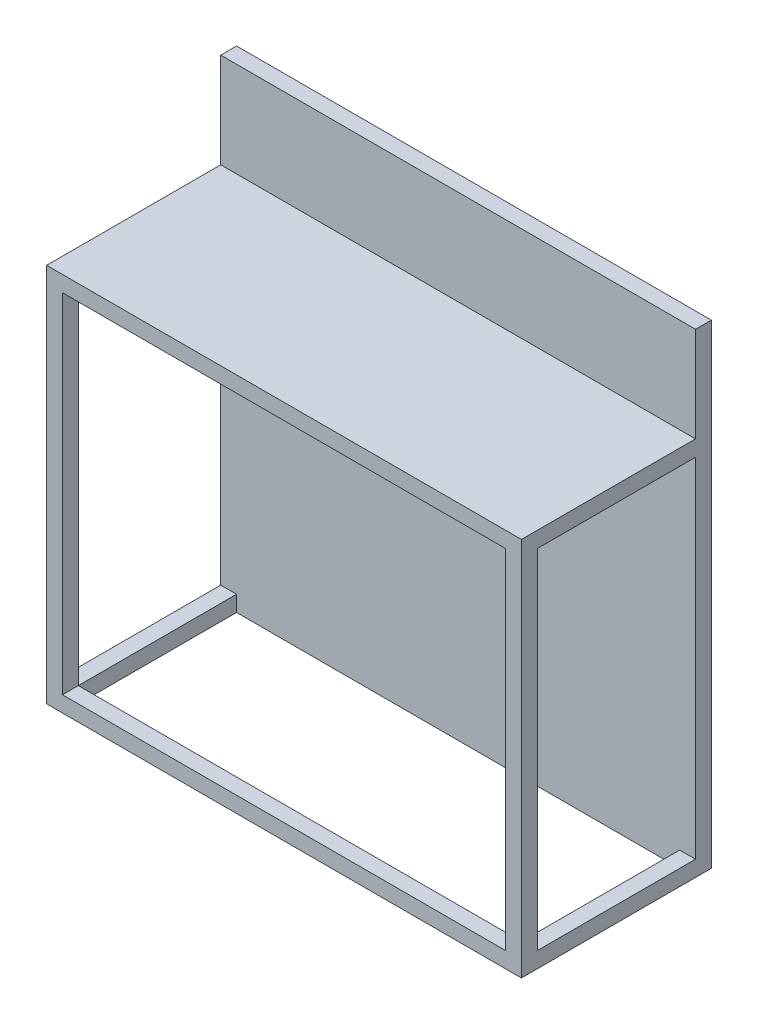
ISO-10303-21;
HEADER;
FILE_DESCRIPTION(('STEP AP214'),'2;1');
FILE_NAME('part.step','',(''),(''),'','','');
FILE_SCHEMA(('AUTOMOTIVE_DESIGN { 1 0 10303 214 1 1 1 1 }'));
ENDSEC;
DATA;
#1=APPLICATION_CONTEXT('core data for automotive mechanical design processes');
#2=APPLICATION_PROTOCOL_DEFINITION('international standard','automotive_design',2000,#1);
#3=PRODUCT_CONTEXT('',#1,'mechanical');
#4=PRODUCT('Part','Part','',(#3));
#5=PRODUCT_RELATED_PRODUCT_CATEGORY('part','',(#4));
#6=PRODUCT_DEFINITION_FORMATION('','',#4);
#7=PRODUCT_DEFINITION_CONTEXT('part definition',#1,'design');
#8=PRODUCT_DEFINITION('design','',#6,#7);
#9=PRODUCT_DEFINITION_SHAPE('','',#8);
#10=(LENGTH_UNIT() NAMED_UNIT(*) SI_UNIT(.MILLI.,.METRE.));
#11=(NAMED_UNIT(*) PLANE_ANGLE_UNIT() SI_UNIT($,.RADIAN.));
#12=(NAMED_UNIT(*) SI_UNIT($,.STERADIAN.) SOLID_ANGLE_UNIT());
#13=UNCERTAINTY_MEASURE_WITH_UNIT(LENGTH_MEASURE(1.E-05),#10,'distance_accuracy_value','');
#14=(GEOMETRIC_REPRESENTATION_CONTEXT(3) GLOBAL_UNCERTAINTY_ASSIGNED_CONTEXT((#13)) GLOBAL_UNIT_ASSIGNED_CONTEXT((#10,
#11,#12)) REPRESENTATION_CONTEXT('',''));
#15=CARTESIAN_POINT('',(0.,0.,0.));
#16=DIRECTION('',(0.,0.,1.));
#17=DIRECTION('',(1.,0.,0.));
#18=AXIS2_PLACEMENT_3D('',#15,#16,#17);
#19=CARTESIAN_POINT('',(700.,400.,550.));
#20=DIRECTION('',(0.,0.,1.));
#21=DIRECTION('',(1.,0.,0.));
#22=AXIS2_PLACEMENT_3D('',#19,#20,#21);
#23=PLANE('',#22);
#24=DIRECTION('',(-1.,0.,0.));
#25=VECTOR('',#24,1.);
#26=CARTESIAN_POINT('',(700.,400.,550.));
#27=LINE('',#26,#25);
#28=CARTESIAN_POINT('',(-700.,400.,550.));
#29=VERTEX_POINT('',#28);
#30=CARTESIAN_POINT('',(-750.,400.,550.));
#31=VERTEX_POINT('',#30);
#32=EDGE_CURVE('E226',#29,#31,#27,.T.);
#33=ORIENTED_EDGE('',*,*,#32,.F.);
#34=DIRECTION('',(0.,-1.,0.));
#35=VECTOR('',#34,1.);
#36=CARTESIAN_POINT('',(-700.,400.,550.));
#37=LINE('',#36,#35);
#38=CARTESIAN_POINT('',(-700.,-700.,550.));
#39=VERTEX_POINT('',#38);
#40=EDGE_CURVE('E183',#29,#39,#37,.T.);
#41=ORIENTED_EDGE('',*,*,#40,.T.);
#42=DIRECTION('',(-1.,0.,0.));
#43=VECTOR('',#42,1.);
#44=CARTESIAN_POINT('',(1614.,-700.,550.));
#45=LINE('',#44,#43);
#46=CARTESIAN_POINT('',(-750.,-700.,550.));
#47=VERTEX_POINT('',#46);
#48=EDGE_CURVE('E202',#39,#47,#45,.T.);
#49=ORIENTED_EDGE('',*,*,#48,.T.);
#50=DIRECTION('',(0.,1.,0.));
#51=VECTOR('',#50,1.);
#52=CARTESIAN_POINT('',(-750.,400.,550.));
#53=LINE('',#52,#51);
#54=EDGE_CURVE('E195',#47,#31,#53,.T.);
#55=ORIENTED_EDGE('',*,*,#54,.T.);
#56=EDGE_LOOP('',(#33,#41,#49,#55));
#57=FACE_BOUND('',#56,.T.);
#58=ADVANCED_FACE('F33',(#57),#23,.F.);
#59=CARTESIAN_POINT('',(750.,-700.,550.));
#60=VERTEX_POINT('',#59);
#61=CARTESIAN_POINT('',(700.,-700.,550.));
#62=VERTEX_POINT('',#61);
#63=EDGE_CURVE('E204',#60,#62,#45,.T.);
#64=ORIENTED_EDGE('',*,*,#63,.T.);
#65=DIRECTION('',(0.,1.,0.));
#66=VECTOR('',#65,1.);
#67=CARTESIAN_POINT('',(700.,400.,550.));
#68=LINE('',#67,#66);
#69=CARTESIAN_POINT('',(700.,400.,550.));
#70=VERTEX_POINT('',#69);
#71=EDGE_CURVE('E161',#62,#70,#68,.T.);
#72=ORIENTED_EDGE('',*,*,#71,.T.);
#73=CARTESIAN_POINT('',(750.,400.,550.));
#74=VERTEX_POINT('',#73);
#75=EDGE_CURVE('E228',#74,#70,#27,.T.);
#76=ORIENTED_EDGE('',*,*,#75,.F.);
#77=DIRECTION('',(0.,1.,0.));
#78=VECTOR('',#77,1.);
#79=CARTESIAN_POINT('',(750.,-750.,550.));
#80=LINE('',#79,#78);
#81=EDGE_CURVE('E207',#60,#74,#80,.T.);
#82=ORIENTED_EDGE('',*,*,#81,.F.);
#83=EDGE_LOOP('',(#64,#72,#76,#82));
#84=FACE_BOUND('',#83,.T.);
#85=ADVANCED_FACE('F324',(#84),#23,.F.);
#86=CARTESIAN_POINT('',(-750.,-750.,600.));
#87=DIRECTION('',(1.,0.,0.));
#88=DIRECTION('',(0.,0.,-1.));
#89=AXIS2_PLACEMENT_3D('',#86,#87,#88);
#90=PLANE('',#89);
#91=DIRECTION('',(0.,0.,1.));
#92=VECTOR('',#91,1.);
#93=CARTESIAN_POINT('',(-750.,-700.,50.0000000000001));
#94=LINE('',#93,#92);
#95=CARTESIAN_POINT('',(-750.,-700.,50.0000000000002));
#96=VERTEX_POINT('',#95);
#97=EDGE_CURVE('E192',#96,#47,#94,.T.);
#98=ORIENTED_EDGE('',*,*,#97,.F.);
#99=DIRECTION('',(0.,-1.,0.));
#100=VECTOR('',#99,1.);
#101=CARTESIAN_POINT('',(-750.,400.,50.));
#102=LINE('',#101,#100);
#103=CARTESIAN_POINT('',(-750.,400.,50.));
#104=VERTEX_POINT('',#103);
#105=EDGE_CURVE('E56',#104,#96,#102,.T.);
#106=ORIENTED_EDGE('',*,*,#105,.F.);
#107=DIRECTION('',(0.,0.,-1.));
#108=VECTOR('',#107,1.);
#109=CARTESIAN_POINT('',(-750.,400.,50.));
#110=LINE('',#109,#108);
#111=EDGE_CURVE('E198',#31,#104,#110,.T.);
#112=ORIENTED_EDGE('',*,*,#111,.F.);
#113=ORIENTED_EDGE('',*,*,#54,.F.);
#114=EDGE_LOOP('',(#98,#106,#112,#113));
#115=FACE_BOUND('',#114,.T.);
#116=DIRECTION('',(0.,0.,1.));
#117=VECTOR('',#116,1.);
#118=CARTESIAN_POINT('',(-750.,450.,50.));
#119=LINE('',#118,#117);
#120=CARTESIAN_POINT('',(-750.,450.,50.));
#121=VERTEX_POINT('',#120);
#122=CARTESIAN_POINT('',(-750.,450.,600.));
#123=VERTEX_POINT('',#122);
#124=EDGE_CURVE('E254',#121,#123,#119,.T.);
#125=ORIENTED_EDGE('',*,*,#124,.F.);
#126=DIRECTION('',(0.,-1.,0.));
#127=VECTOR('',#126,1.);
#128=CARTESIAN_POINT('',(-750.,750.,50.));
#129=LINE('',#128,#127);
#130=CARTESIAN_POINT('',(-750.,750.,50.));
#131=VERTEX_POINT('',#130);
#132=EDGE_CURVE('E251',#131,#121,#129,.T.);
#133=ORIENTED_EDGE('',*,*,#132,.F.);
#134=DIRECTION('',(0.,0.,-1.));
#135=VECTOR('',#134,1.);
#136=CARTESIAN_POINT('',(-750.,750.,600.));
#137=LINE('',#136,#135);
#138=CARTESIAN_POINT('',(-750.,750.,0.));
#139=VERTEX_POINT('',#138);
#140=EDGE_CURVE('E275',#131,#139,#137,.T.);
#141=ORIENTED_EDGE('',*,*,#140,.T.);
#142=DIRECTION('',(0.,-1.,0.));
#143=VECTOR('',#142,1.);
#144=CARTESIAN_POINT('',(-750.,-750.,0.));
#145=LINE('',#144,#143);
#146=CARTESIAN_POINT('',(-750.,-750.,0.));
#147=VERTEX_POINT('',#146);
#148=EDGE_CURVE('E266',#139,#147,#145,.T.);
#149=ORIENTED_EDGE('',*,*,#148,.T.);
#150=DIRECTION('',(0.,0.,-1.));
#151=VECTOR('',#150,1.);
#152=CARTESIAN_POINT('',(-750.,-750.,600.));
#153=LINE('',#152,#151);
#154=CARTESIAN_POINT('',(-750.,-750.,600.));
#155=VERTEX_POINT('',#154);
#156=EDGE_CURVE('E11',#155,#147,#153,.T.);
#157=ORIENTED_EDGE('',*,*,#156,.F.);
#158=DIRECTION('',(0.,-1.,0.));
#159=VECTOR('',#158,1.);
#160=CARTESIAN_POINT('',(-750.,-750.,600.));
#161=LINE('',#160,#159);
#162=EDGE_CURVE('E267',#123,#155,#161,.T.);
#163=ORIENTED_EDGE('',*,*,#162,.F.);
#164=EDGE_LOOP('',(#125,#133,#141,#149,#157,#163));
#165=FACE_BOUND('',#164,.T.);
#166=ADVANCED_FACE('F35',(#115,#165),#90,.F.);
#167=CARTESIAN_POINT('',(750.,-750.,600.));
#168=DIRECTION('',(0.,1.,0.));
#169=DIRECTION('',(-1.,0.,0.));
#170=AXIS2_PLACEMENT_3D('',#167,#168,#169);
#171=PLANE('',#170);
#172=DIRECTION('',(1.,0.,0.));
#173=VECTOR('',#172,1.);
#174=CARTESIAN_POINT('',(700.,-750.,50.0000000000001));
#175=LINE('',#174,#173);
#176=CARTESIAN_POINT('',(-700.,-750.,49.9999999999999));
#177=VERTEX_POINT('',#176);
#178=CARTESIAN_POINT('',(700.,-750.,50.0000000000001));
#179=VERTEX_POINT('',#178);
#180=EDGE_CURVE('E234',#177,#179,#175,.T.);
#181=ORIENTED_EDGE('',*,*,#180,.F.);
#182=DIRECTION('',(0.,0.,-1.));
#183=VECTOR('',#182,1.);
#184=CARTESIAN_POINT('',(-700.,-750.,49.9999999999999));
#185=LINE('',#184,#183);
#186=CARTESIAN_POINT('',(-700.,-750.,550.));
#187=VERTEX_POINT('',#186);
#188=EDGE_CURVE('E223',#187,#177,#185,.T.);
#189=ORIENTED_EDGE('',*,*,#188,.F.);
#190=DIRECTION('',(-1.,0.,0.));
#191=VECTOR('',#190,1.);
#192=CARTESIAN_POINT('',(700.,-750.,550.));
#193=LINE('',#192,#191);
#194=CARTESIAN_POINT('',(700.,-750.,550.));
#195=VERTEX_POINT('',#194);
#196=EDGE_CURVE('E227',#195,#187,#193,.T.);
#197=ORIENTED_EDGE('',*,*,#196,.F.);
#198=DIRECTION('',(0.,0.,1.));
#199=VECTOR('',#198,1.);
#200=CARTESIAN_POINT('',(700.,-750.,50.0000000000001));
#201=LINE('',#200,#199);
#202=EDGE_CURVE('E237',#179,#195,#201,.T.);
#203=ORIENTED_EDGE('',*,*,#202,.F.);
#204=EDGE_LOOP('',(#181,#189,#197,#203));
#205=FACE_BOUND('',#204,.T.);
#206=DIRECTION('',(1.,0.,0.));
#207=VECTOR('',#206,1.);
#208=CARTESIAN_POINT('',(750.,-750.,0.));
#209=LINE('',#208,#207);
#210=CARTESIAN_POINT('',(750.,-750.,0.));
#211=VERTEX_POINT('',#210);
#212=EDGE_CURVE('E278',#147,#211,#209,.T.);
#213=ORIENTED_EDGE('',*,*,#212,.T.);
#214=DIRECTION('',(0.,0.,-1.));
#215=VECTOR('',#214,1.);
#216=CARTESIAN_POINT('',(750.,-750.,600.));
#217=LINE('',#216,#215);
#218=CARTESIAN_POINT('',(750.,-750.,600.));
#219=VERTEX_POINT('',#218);
#220=EDGE_CURVE('E41',#219,#211,#217,.T.);
#221=ORIENTED_EDGE('',*,*,#220,.F.);
#222=DIRECTION('',(1.,0.,0.));
#223=VECTOR('',#222,1.);
#224=CARTESIAN_POINT('',(750.,-750.,600.));
#225=LINE('',#224,#223);
#226=EDGE_CURVE('E269',#155,#219,#225,.T.);
#227=ORIENTED_EDGE('',*,*,#226,.F.);
#228=ORIENTED_EDGE('',*,*,#156,.T.);
#229=EDGE_LOOP('',(#213,#221,#227,#228));
#230=FACE_BOUND('',#229,.T.);
#231=ADVANCED_FACE('F315',(#205,#230),#171,.F.);
#232=CARTESIAN_POINT('',(750.,-750.,600.));
#233=DIRECTION('',(-1.,0.,0.));
#234=DIRECTION('',(0.,0.,1.));
#235=AXIS2_PLACEMENT_3D('',#232,#233,#234);
#236=PLANE('',#235);
#237=DIRECTION('',(0.,0.,-1.));
#238=VECTOR('',#237,1.);
#239=CARTESIAN_POINT('',(750.,400.,600.));
#240=LINE('',#239,#238);
#241=CARTESIAN_POINT('',(750.,400.,50.));
#242=VERTEX_POINT('',#241);
#243=EDGE_CURVE('E220',#74,#242,#240,.T.);
#244=ORIENTED_EDGE('',*,*,#243,.T.);
#245=DIRECTION('',(0.,-1.,0.));
#246=VECTOR('',#245,1.);
#247=CARTESIAN_POINT('',(750.,-750.,50.0000000000002));
#248=LINE('',#247,#246);
#249=CARTESIAN_POINT('',(750.,-700.,50.0000000000001));
#250=VERTEX_POINT('',#249);
#251=EDGE_CURVE('E210',#242,#250,#248,.T.);
#252=ORIENTED_EDGE('',*,*,#251,.T.);
#253=DIRECTION('',(0.,0.,1.));
#254=VECTOR('',#253,1.);
#255=CARTESIAN_POINT('',(750.,-700.,600.));
#256=LINE('',#255,#254);
#257=EDGE_CURVE('E217',#250,#60,#256,.T.);
#258=ORIENTED_EDGE('',*,*,#257,.T.);
#259=ORIENTED_EDGE('',*,*,#81,.T.);
#260=EDGE_LOOP('',(#244,#252,#258,#259));
#261=FACE_BOUND('',#260,.T.);
#262=DIRECTION('',(0.,0.,-1.));
#263=VECTOR('',#262,1.);
#264=CARTESIAN_POINT('',(750.,750.,600.));
#265=LINE('',#264,#263);
#266=CARTESIAN_POINT('',(750.,750.,50.));
#267=VERTEX_POINT('',#266);
#268=CARTESIAN_POINT('',(750.,750.,0.));
#269=VERTEX_POINT('',#268);
#270=EDGE_CURVE('E286',#267,#269,#265,.T.);
#271=ORIENTED_EDGE('',*,*,#270,.F.);
#272=DIRECTION('',(0.,1.,0.));
#273=VECTOR('',#272,1.);
#274=CARTESIAN_POINT('',(750.,750.,50.));
#275=LINE('',#274,#273);
#276=CARTESIAN_POINT('',(750.,450.,50.));
#277=VERTEX_POINT('',#276);
#278=EDGE_CURVE('E244',#277,#267,#275,.T.);
#279=ORIENTED_EDGE('',*,*,#278,.F.);
#280=DIRECTION('',(0.,0.,-1.));
#281=VECTOR('',#280,1.);
#282=CARTESIAN_POINT('',(750.,450.,50.));
#283=LINE('',#282,#281);
#284=CARTESIAN_POINT('',(750.,450.,600.));
#285=VERTEX_POINT('',#284);
#286=EDGE_CURVE('E259',#285,#277,#283,.T.);
#287=ORIENTED_EDGE('',*,*,#286,.F.);
#288=DIRECTION('',(0.,1.,0.));
#289=VECTOR('',#288,1.);
#290=CARTESIAN_POINT('',(750.,-750.,600.));
#291=LINE('',#290,#289);
#292=EDGE_CURVE('E272',#219,#285,#291,.T.);
#293=ORIENTED_EDGE('',*,*,#292,.F.);
#294=ORIENTED_EDGE('',*,*,#220,.T.);
#295=DIRECTION('',(0.,1.,0.));
#296=VECTOR('',#295,1.);
#297=CARTESIAN_POINT('',(750.,-750.,0.));
#298=LINE('',#297,#296);
#299=EDGE_CURVE('E280',#211,#269,#298,.T.);
#300=ORIENTED_EDGE('',*,*,#299,.T.);
#301=EDGE_LOOP('',(#271,#279,#287,#293,#294,#300));
#302=FACE_BOUND('',#301,.T.);
#303=ADVANCED_FACE('F293',(#261,#302),#236,.F.);
#304=CARTESIAN_POINT('',(750.,750.,600.));
#305=DIRECTION('',(0.,-1.,0.));
#306=DIRECTION('',(1.,0.,0.));
#307=AXIS2_PLACEMENT_3D('',#304,#305,#306);
#308=PLANE('',#307);
#309=ORIENTED_EDGE('',*,*,#140,.F.);
#310=DIRECTION('',(-1.,0.,0.));
#311=VECTOR('',#310,1.);
#312=CARTESIAN_POINT('',(750.001,750.,50.));
#313=LINE('',#312,#311);
#314=EDGE_CURVE('E257',#267,#131,#313,.T.);
#315=ORIENTED_EDGE('',*,*,#314,.F.);
#316=ORIENTED_EDGE('',*,*,#270,.T.);
#317=DIRECTION('',(-1.,0.,0.));
#318=VECTOR('',#317,1.);
#319=CARTESIAN_POINT('',(750.,750.,0.));
#320=LINE('',#319,#318);
#321=EDGE_CURVE('E270',#269,#139,#320,.T.);
#322=ORIENTED_EDGE('',*,*,#321,.T.);
#323=EDGE_LOOP('',(#309,#315,#316,#322));
#324=FACE_BOUND('',#323,.T.);
#325=ADVANCED_FACE('F303',(#324),#308,.F.);
#326=CARTESIAN_POINT('',(0.,0.,600.));
#327=DIRECTION('',(0.,0.,1.));
#328=DIRECTION('',(1.,0.,0.));
#329=AXIS2_PLACEMENT_3D('',#326,#327,#328);
#330=PLANE('',#329);
#331=DIRECTION('',(0.,-1.,0.));
#332=VECTOR('',#331,1.);
#333=CARTESIAN_POINT('',(-700.,400.,600.));
#334=LINE('',#333,#332);
#335=CARTESIAN_POINT('',(-700.,400.,600.));
#336=VERTEX_POINT('',#335);
#337=CARTESIAN_POINT('',(-700.,-700.,600.));
#338=VERTEX_POINT('',#337);
#339=EDGE_CURVE('E48',#336,#338,#334,.T.);
#340=ORIENTED_EDGE('',*,*,#339,.F.);
#341=DIRECTION('',(-1.,0.,0.));
#342=VECTOR('',#341,1.);
#343=CARTESIAN_POINT('',(-700.,400.,600.));
#344=LINE('',#343,#342);
#345=CARTESIAN_POINT('',(700.,400.,600.));
#346=VERTEX_POINT('',#345);
#347=EDGE_CURVE('E176',#346,#336,#344,.T.);
#348=ORIENTED_EDGE('',*,*,#347,.F.);
#349=DIRECTION('',(0.,1.,0.));
#350=VECTOR('',#349,1.);
#351=CARTESIAN_POINT('',(700.,400.,600.));
#352=LINE('',#351,#350);
#353=CARTESIAN_POINT('',(700.,-700.,600.));
#354=VERTEX_POINT('',#353);
#355=EDGE_CURVE('E158',#354,#346,#352,.T.);
#356=ORIENTED_EDGE('',*,*,#355,.F.);
#357=DIRECTION('',(1.,0.,0.));
#358=VECTOR('',#357,1.);
#359=CARTESIAN_POINT('',(-700.,-700.,600.));
#360=LINE('',#359,#358);
#361=EDGE_CURVE('E169',#338,#354,#360,.T.);
#362=ORIENTED_EDGE('',*,*,#361,.F.);
#363=EDGE_LOOP('',(#340,#348,#356,#362));
#364=FACE_BOUND('',#363,.T.);
#365=DIRECTION('',(-1.,0.,0.));
#366=VECTOR('',#365,1.);
#367=CARTESIAN_POINT('',(750.001,450.,600.));
#368=LINE('',#367,#366);
#369=EDGE_CURVE('E260',#285,#123,#368,.T.);
#370=ORIENTED_EDGE('',*,*,#369,.T.);
#371=ORIENTED_EDGE('',*,*,#162,.T.);
#372=ORIENTED_EDGE('',*,*,#226,.T.);
#373=ORIENTED_EDGE('',*,*,#292,.T.);
#374=EDGE_LOOP('',(#370,#371,#372,#373));
#375=FACE_BOUND('',#374,.T.);
#376=ADVANCED_FACE('F173',(#364,#375),#330,.T.);
#377=CARTESIAN_POINT('',(0.,0.,0.));
#378=DIRECTION('',(0.,0.,1.));
#379=DIRECTION('',(1.,0.,0.));
#380=AXIS2_PLACEMENT_3D('',#377,#378,#379);
#381=PLANE('',#380);
#382=ORIENTED_EDGE('',*,*,#148,.F.);
#383=ORIENTED_EDGE('',*,*,#321,.F.);
#384=ORIENTED_EDGE('',*,*,#299,.F.);
#385=ORIENTED_EDGE('',*,*,#212,.F.);
#386=EDGE_LOOP('',(#382,#383,#384,#385));
#387=FACE_BOUND('',#386,.T.);
#388=ADVANCED_FACE('F300',(#387),#381,.F.);
#389=CARTESIAN_POINT('',(750.001,750.,50.));
#390=DIRECTION('',(0.,0.,-1.));
#391=DIRECTION('',(0.,1.,0.));
#392=AXIS2_PLACEMENT_3D('',#389,#390,#391);
#393=PLANE('',#392);
#394=ORIENTED_EDGE('',*,*,#278,.T.);
#395=ORIENTED_EDGE('',*,*,#314,.T.);
#396=ORIENTED_EDGE('',*,*,#132,.T.);
#397=DIRECTION('',(-1.,0.,0.));
#398=VECTOR('',#397,1.);
#399=CARTESIAN_POINT('',(750.001,450.,50.));
#400=LINE('',#399,#398);
#401=EDGE_CURVE('E256',#277,#121,#400,.T.);
#402=ORIENTED_EDGE('',*,*,#401,.F.);
#403=EDGE_LOOP('',(#394,#395,#396,#402));
#404=FACE_BOUND('',#403,.T.);
#405=ADVANCED_FACE('F307',(#404),#393,.F.);
#406=CARTESIAN_POINT('',(750.001,450.,50.));
#407=DIRECTION('',(0.,-1.,0.));
#408=DIRECTION('',(0.,0.,-1.));
#409=AXIS2_PLACEMENT_3D('',#406,#407,#408);
#410=PLANE('',#409);
#411=ORIENTED_EDGE('',*,*,#286,.T.);
#412=ORIENTED_EDGE('',*,*,#401,.T.);
#413=ORIENTED_EDGE('',*,*,#124,.T.);
#414=ORIENTED_EDGE('',*,*,#369,.F.);
#415=EDGE_LOOP('',(#411,#412,#413,#414));
#416=FACE_BOUND('',#415,.T.);
#417=ADVANCED_FACE('F311',(#416),#410,.F.);
#418=CARTESIAN_POINT('',(-700.,400.,49.9999999999999));
#419=DIRECTION('',(-1.,0.,0.));
#420=DIRECTION('',(0.,-1.,0.));
#421=AXIS2_PLACEMENT_3D('',#418,#419,#420);
#422=PLANE('',#421);
#423=DIRECTION('',(0.,-1.,0.));
#424=VECTOR('',#423,1.);
#425=CARTESIAN_POINT('',(-700.,400.,49.9999999999999));
#426=LINE('',#425,#424);
#427=CARTESIAN_POINT('',(-700.,-700.,50.0000000000001));
#428=VERTEX_POINT('',#427);
#429=EDGE_CURVE('E231',#428,#177,#426,.T.);
#430=ORIENTED_EDGE('',*,*,#429,.F.);
#431=DIRECTION('',(0.,0.,1.));
#432=VECTOR('',#431,1.);
#433=CARTESIAN_POINT('',(-700.,-700.,49.9999999999999));
#434=LINE('',#433,#432);
#435=EDGE_CURVE('E215',#428,#39,#434,.T.);
#436=ORIENTED_EDGE('',*,*,#435,.T.);
#437=DIRECTION('',(0.,-1.,0.));
#438=VECTOR('',#437,1.);
#439=CARTESIAN_POINT('',(-700.,400.,550.));
#440=LINE('',#439,#438);
#441=EDGE_CURVE('E242',#39,#187,#440,.T.);
#442=ORIENTED_EDGE('',*,*,#441,.T.);
#443=ORIENTED_EDGE('',*,*,#188,.T.);
#444=EDGE_LOOP('',(#430,#436,#442,#443));
#445=FACE_BOUND('',#444,.T.);
#446=ADVANCED_FACE('F340',(#445),#422,.F.);
#447=ORIENTED_EDGE('',*,*,#441,.F.);
#448=DIRECTION('',(1.,0.,0.));
#449=VECTOR('',#448,1.);
#450=CARTESIAN_POINT('',(700.,-700.,550.));
#451=LINE('',#450,#449);
#452=EDGE_CURVE('E189',#39,#62,#451,.T.);
#453=ORIENTED_EDGE('',*,*,#452,.T.);
#454=DIRECTION('',(0.,-1.,0.));
#455=VECTOR('',#454,1.);
#456=CARTESIAN_POINT('',(700.,400.,550.));
#457=LINE('',#456,#455);
#458=EDGE_CURVE('E245',#62,#195,#457,.T.);
#459=ORIENTED_EDGE('',*,*,#458,.T.);
#460=ORIENTED_EDGE('',*,*,#196,.T.);
#461=EDGE_LOOP('',(#447,#453,#459,#460));
#462=FACE_BOUND('',#461,.T.);
#463=ADVANCED_FACE('F330',(#462),#23,.F.);
#464=CARTESIAN_POINT('',(700.,400.,50.0000000000001));
#465=DIRECTION('',(1.,0.,0.));
#466=DIRECTION('',(0.,1.,0.));
#467=AXIS2_PLACEMENT_3D('',#464,#465,#466);
#468=PLANE('',#467);
#469=ORIENTED_EDGE('',*,*,#458,.F.);
#470=DIRECTION('',(0.,0.,-1.));
#471=VECTOR('',#470,1.);
#472=CARTESIAN_POINT('',(700.,-700.,50.0000000000001));
#473=LINE('',#472,#471);
#474=CARTESIAN_POINT('',(700.,-700.,50.0000000000001));
#475=VERTEX_POINT('',#474);
#476=EDGE_CURVE('E213',#62,#475,#473,.T.);
#477=ORIENTED_EDGE('',*,*,#476,.T.);
#478=DIRECTION('',(0.,-1.,0.));
#479=VECTOR('',#478,1.);
#480=CARTESIAN_POINT('',(700.,400.,50.0000000000001));
#481=LINE('',#480,#479);
#482=EDGE_CURVE('E247',#475,#179,#481,.T.);
#483=ORIENTED_EDGE('',*,*,#482,.T.);
#484=ORIENTED_EDGE('',*,*,#202,.T.);
#485=EDGE_LOOP('',(#469,#477,#483,#484));
#486=FACE_BOUND('',#485,.T.);
#487=ADVANCED_FACE('F339',(#486),#468,.F.);
#488=CARTESIAN_POINT('',(700.,400.,50.0000000000001));
#489=DIRECTION('',(0.,0.,-1.));
#490=DIRECTION('',(-1.,0.,0.));
#491=AXIS2_PLACEMENT_3D('',#488,#489,#490);
#492=PLANE('',#491);
#493=ORIENTED_EDGE('',*,*,#482,.F.);
#494=DIRECTION('',(-1.,0.,0.));
#495=VECTOR('',#494,1.);
#496=CARTESIAN_POINT('',(1614.,-700.,50.0000000000001));
#497=LINE('',#496,#495);
#498=EDGE_CURVE('E205',#250,#475,#497,.T.);
#499=ORIENTED_EDGE('',*,*,#498,.F.);
#500=ORIENTED_EDGE('',*,*,#251,.F.);
#501=DIRECTION('',(1.,0.,0.));
#502=VECTOR('',#501,1.);
#503=CARTESIAN_POINT('',(700.,400.,50.0000000000001));
#504=LINE('',#503,#502);
#505=EDGE_CURVE('E224',#104,#242,#504,.T.);
#506=ORIENTED_EDGE('',*,*,#505,.F.);
#507=ORIENTED_EDGE('',*,*,#105,.T.);
#508=EDGE_CURVE('E201',#428,#96,#497,.T.);
#509=ORIENTED_EDGE('',*,*,#508,.F.);
#510=ORIENTED_EDGE('',*,*,#429,.T.);
#511=ORIENTED_EDGE('',*,*,#180,.T.);
#512=EDGE_LOOP('',(#493,#499,#500,#506,#507,#509,#510,#511));
#513=FACE_BOUND('',#512,.T.);
#514=ADVANCED_FACE('F346',(#513),#492,.F.);
#515=CARTESIAN_POINT('',(0.,400.,0.));
#516=DIRECTION('',(0.,-1.,0.));
#517=DIRECTION('',(1.,0.,0.));
#518=AXIS2_PLACEMENT_3D('',#515,#516,#517);
#519=PLANE('',#518);
#520=ORIENTED_EDGE('',*,*,#75,.T.);
#521=DIRECTION('',(0.,0.,1.));
#522=VECTOR('',#521,1.);
#523=CARTESIAN_POINT('',(700.,400.,280.));
#524=LINE('',#523,#522);
#525=EDGE_CURVE('E165',#70,#346,#524,.T.);
#526=ORIENTED_EDGE('',*,*,#525,.T.);
#527=ORIENTED_EDGE('',*,*,#347,.T.);
#528=DIRECTION('',(0.,0.,1.));
#529=VECTOR('',#528,1.);
#530=CARTESIAN_POINT('',(-700.,400.,280.));
#531=LINE('',#530,#529);
#532=EDGE_CURVE('E181',#29,#336,#531,.T.);
#533=ORIENTED_EDGE('',*,*,#532,.F.);
#534=ORIENTED_EDGE('',*,*,#32,.T.);
#535=ORIENTED_EDGE('',*,*,#111,.T.);
#536=ORIENTED_EDGE('',*,*,#505,.T.);
#537=ORIENTED_EDGE('',*,*,#243,.F.);
#538=EDGE_LOOP('',(#520,#526,#527,#533,#534,#535,#536,#537));
#539=FACE_BOUND('',#538,.T.);
#540=ADVANCED_FACE('F364',(#539),#519,.T.);
#541=CARTESIAN_POINT('',(1614.,-700.,50.0000000000001));
#542=DIRECTION('',(0.,-1.,0.));
#543=DIRECTION('',(0.,0.,-1.));
#544=AXIS2_PLACEMENT_3D('',#541,#542,#543);
#545=PLANE('',#544);
#546=ORIENTED_EDGE('',*,*,#498,.T.);
#547=ORIENTED_EDGE('',*,*,#476,.F.);
#548=ORIENTED_EDGE('',*,*,#63,.F.);
#549=ORIENTED_EDGE('',*,*,#257,.F.);
#550=EDGE_LOOP('',(#546,#547,#548,#549));
#551=FACE_BOUND('',#550,.T.);
#552=ADVANCED_FACE('F375',(#551),#545,.F.);
#553=ORIENTED_EDGE('',*,*,#508,.T.);
#554=ORIENTED_EDGE('',*,*,#97,.T.);
#555=ORIENTED_EDGE('',*,*,#48,.F.);
#556=ORIENTED_EDGE('',*,*,#435,.F.);
#557=EDGE_LOOP('',(#553,#554,#555,#556));
#558=FACE_BOUND('',#557,.T.);
#559=ADVANCED_FACE('F359',(#558),#545,.F.);
#560=CARTESIAN_POINT('',(-700.,-700.,280.));
#561=DIRECTION('',(0.,-1.,0.));
#562=DIRECTION('',(1.,0.,0.));
#563=AXIS2_PLACEMENT_3D('',#560,#561,#562);
#564=PLANE('',#563);
#565=DIRECTION('',(0.,0.,1.));
#566=VECTOR('',#565,1.);
#567=CARTESIAN_POINT('',(-700.,-700.,280.));
#568=LINE('',#567,#566);
#569=EDGE_CURVE('E166',#39,#338,#568,.T.);
#570=ORIENTED_EDGE('',*,*,#569,.T.);
#571=ORIENTED_EDGE('',*,*,#361,.T.);
#572=DIRECTION('',(0.,0.,1.));
#573=VECTOR('',#572,1.);
#574=CARTESIAN_POINT('',(700.,-700.,280.));
#575=LINE('',#574,#573);
#576=EDGE_CURVE('E154',#62,#354,#575,.T.);
#577=ORIENTED_EDGE('',*,*,#576,.F.);
#578=ORIENTED_EDGE('',*,*,#452,.F.);
#579=EDGE_LOOP('',(#570,#571,#577,#578));
#580=FACE_BOUND('',#579,.T.);
#581=ADVANCED_FACE('F170',(#580),#564,.F.);
#582=CARTESIAN_POINT('',(700.,400.,280.));
#583=DIRECTION('',(1.,0.,0.));
#584=DIRECTION('',(0.,1.,0.));
#585=AXIS2_PLACEMENT_3D('',#582,#583,#584);
#586=PLANE('',#585);
#587=ORIENTED_EDGE('',*,*,#576,.T.);
#588=ORIENTED_EDGE('',*,*,#355,.T.);
#589=ORIENTED_EDGE('',*,*,#525,.F.);
#590=ORIENTED_EDGE('',*,*,#71,.F.);
#591=EDGE_LOOP('',(#587,#588,#589,#590));
#592=FACE_BOUND('',#591,.T.);
#593=ADVANCED_FACE('F156',(#592),#586,.F.);
#594=CARTESIAN_POINT('',(-700.,400.,280.));
#595=DIRECTION('',(-1.,0.,0.));
#596=DIRECTION('',(0.,-1.,0.));
#597=AXIS2_PLACEMENT_3D('',#594,#595,#596);
#598=PLANE('',#597);
#599=ORIENTED_EDGE('',*,*,#532,.T.);
#600=ORIENTED_EDGE('',*,*,#339,.T.);
#601=ORIENTED_EDGE('',*,*,#569,.F.);
#602=ORIENTED_EDGE('',*,*,#40,.F.);
#603=EDGE_LOOP('',(#599,#600,#601,#602));
#604=FACE_BOUND('',#603,.T.);
#605=ADVANCED_FACE('F357',(#604),#598,.F.);
#606=CLOSED_SHELL('',(#58,#85,#166,#231,#303,#325,#376,#388,#405,#417,#446,#463,#487,#514,#540,
#552,#559,#581,#593,#605));
#607=MANIFOLD_SOLID_BREP('B2',#606);
#608=ADVANCED_BREP_SHAPE_REPRESENTATION('',(#18,#607),#14);
#609=SHAPE_DEFINITION_REPRESENTATION(#9,#608);
ENDSEC;
END-ISO-10303-21;
